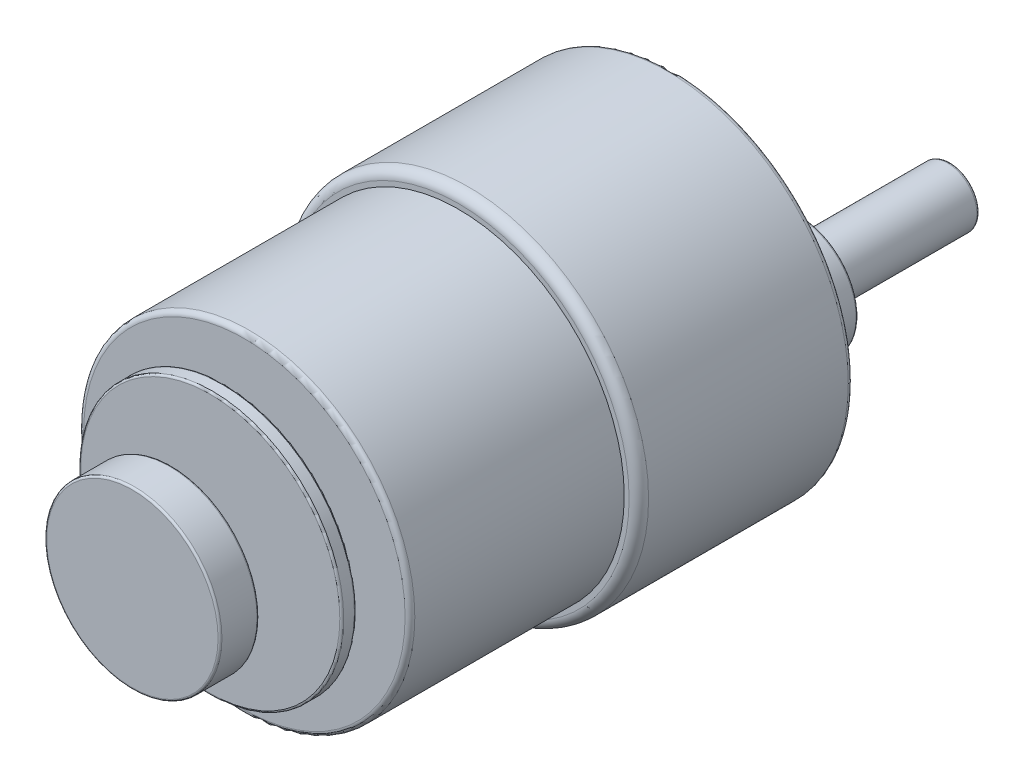
ISO-10303-21;
HEADER;
FILE_DESCRIPTION(('STEP AP214'),'2;1');
FILE_NAME('part.step','',(''),(''),'','','');
FILE_SCHEMA(('AUTOMOTIVE_DESIGN { 1 0 10303 214 1 1 1 1 }'));
ENDSEC;
DATA;
#1=APPLICATION_CONTEXT('core data for automotive mechanical design processes');
#2=APPLICATION_PROTOCOL_DEFINITION('international standard','automotive_design',2000,#1);
#3=PRODUCT_CONTEXT('',#1,'mechanical');
#4=PRODUCT('Part','Part','',(#3));
#5=PRODUCT_RELATED_PRODUCT_CATEGORY('part','',(#4));
#6=PRODUCT_DEFINITION_FORMATION('','',#4);
#7=PRODUCT_DEFINITION_CONTEXT('part definition',#1,'design');
#8=PRODUCT_DEFINITION('design','',#6,#7);
#9=PRODUCT_DEFINITION_SHAPE('','',#8);
#10=(LENGTH_UNIT() NAMED_UNIT(*) SI_UNIT(.MILLI.,.METRE.));
#11=(NAMED_UNIT(*) PLANE_ANGLE_UNIT() SI_UNIT($,.RADIAN.));
#12=(NAMED_UNIT(*) SI_UNIT($,.STERADIAN.) SOLID_ANGLE_UNIT());
#13=UNCERTAINTY_MEASURE_WITH_UNIT(LENGTH_MEASURE(1.E-05),#10,'distance_accuracy_value','');
#14=(GEOMETRIC_REPRESENTATION_CONTEXT(3) GLOBAL_UNCERTAINTY_ASSIGNED_CONTEXT((#13)) GLOBAL_UNIT_ASSIGNED_CONTEXT((#10,
#11,#12)) REPRESENTATION_CONTEXT('',''));
#15=CARTESIAN_POINT('',(0.,0.,0.));
#16=DIRECTION('',(0.,0.,1.));
#17=DIRECTION('',(1.,0.,0.));
#18=AXIS2_PLACEMENT_3D('',#15,#16,#17);
#19=CARTESIAN_POINT('',(0.,0.,22.));
#20=DIRECTION('',(0.,0.,-1.));
#21=DIRECTION('',(-1.,0.,0.));
#22=AXIS2_PLACEMENT_3D('',#19,#20,#21);
#23=CYLINDRICAL_SURFACE('',#22,17.);
#24=CARTESIAN_POINT('',(0.,0.,21.5));
#25=DIRECTION('',(0.,0.,1.));
#26=DIRECTION('',(1.,0.,0.));
#27=AXIS2_PLACEMENT_3D('',#24,#25,#26);
#28=CIRCLE('',#27,17.);
#29=CARTESIAN_POINT('',(17.,0.,21.5));
#30=VERTEX_POINT('',#29);
#31=EDGE_CURVE('E109',#30,#30,#28,.F.);
#32=ORIENTED_EDGE('',*,*,#31,.T.);
#33=EDGE_LOOP('',(#32));
#34=FACE_BOUND('',#33,.T.);
#35=CARTESIAN_POINT('',(0.,0.,0.));
#36=DIRECTION('',(0.,0.,1.));
#37=DIRECTION('',(1.,0.,0.));
#38=AXIS2_PLACEMENT_3D('',#35,#36,#37);
#39=CIRCLE('',#38,17.);
#40=CARTESIAN_POINT('',(17.,0.,0.));
#41=VERTEX_POINT('',#40);
#42=EDGE_CURVE('E118',#41,#41,#39,.T.);
#43=ORIENTED_EDGE('',*,*,#42,.T.);
#44=EDGE_LOOP('',(#43));
#45=FACE_BOUND('',#44,.T.);
#46=ADVANCED_FACE('F37',(#34,#45),#23,.T.);
#47=CARTESIAN_POINT('',(0.,0.,22.));
#48=DIRECTION('',(0.,0.,1.));
#49=DIRECTION('',(1.,0.,0.));
#50=AXIS2_PLACEMENT_3D('',#47,#48,#49);
#51=PLANE('',#50);
#52=CARTESIAN_POINT('',(0.,0.,22.));
#53=DIRECTION('',(0.,0.,1.));
#54=DIRECTION('',(1.,0.,0.));
#55=AXIS2_PLACEMENT_3D('',#52,#53,#54);
#56=CIRCLE('',#55,16.5);
#57=CARTESIAN_POINT('',(16.5,0.,22.));
#58=VERTEX_POINT('',#57);
#59=EDGE_CURVE('E113',#58,#58,#56,.T.);
#60=ORIENTED_EDGE('',*,*,#59,.T.);
#61=EDGE_LOOP('',(#60));
#62=FACE_BOUND('',#61,.T.);
#63=CARTESIAN_POINT('',(0.,0.,22.));
#64=DIRECTION('',(0.,0.,1.));
#65=DIRECTION('',(1.,0.,0.));
#66=AXIS2_PLACEMENT_3D('',#63,#64,#65);
#67=CIRCLE('',#66,3.);
#68=CARTESIAN_POINT('',(3.,0.,22.));
#69=VERTEX_POINT('',#68);
#70=EDGE_CURVE('E117',#69,#69,#67,.T.);
#71=ORIENTED_EDGE('',*,*,#70,.F.);
#72=EDGE_LOOP('',(#71));
#73=FACE_BOUND('',#72,.T.);
#74=ADVANCED_FACE('F171',(#62,#73),#51,.T.);
#75=CARTESIAN_POINT('',(0.,0.,-22.));
#76=DIRECTION('',(0.,0.,1.));
#77=DIRECTION('',(1.,0.,0.));
#78=AXIS2_PLACEMENT_3D('',#75,#76,#77);
#79=CYLINDRICAL_SURFACE('',#78,18.5);
#80=CARTESIAN_POINT('',(0.,0.,-1.));
#81=DIRECTION('',(0.,0.,-1.));
#82=DIRECTION('',(-1.,0.,0.));
#83=AXIS2_PLACEMENT_3D('',#80,#81,#82);
#84=CIRCLE('',#83,18.5);
#85=CARTESIAN_POINT('',(-18.5,0.,-1.));
#86=VERTEX_POINT('',#85);
#87=EDGE_CURVE('E45',#86,#86,#84,.T.);
#88=ORIENTED_EDGE('',*,*,#87,.T.);
#89=EDGE_LOOP('',(#88));
#90=FACE_BOUND('',#89,.T.);
#91=CARTESIAN_POINT('',(0.,0.,-21.5));
#92=DIRECTION('',(0.,0.,-1.));
#93=DIRECTION('',(-1.,0.,0.));
#94=AXIS2_PLACEMENT_3D('',#91,#92,#93);
#95=CIRCLE('',#94,18.5);
#96=CARTESIAN_POINT('',(-18.5,0.,-21.5));
#97=VERTEX_POINT('',#96);
#98=EDGE_CURVE('E101',#97,#97,#95,.F.);
#99=ORIENTED_EDGE('',*,*,#98,.T.);
#100=EDGE_LOOP('',(#99));
#101=FACE_BOUND('',#100,.T.);
#102=ADVANCED_FACE('F177',(#90,#101),#79,.T.);
#103=CARTESIAN_POINT('',(0.,0.,-22.));
#104=DIRECTION('',(0.,0.,-1.));
#105=DIRECTION('',(-1.,0.,0.));
#106=AXIS2_PLACEMENT_3D('',#103,#104,#105);
#107=PLANE('',#106);
#108=CARTESIAN_POINT('',(0.,0.,-22.));
#109=DIRECTION('',(0.,0.,-1.));
#110=DIRECTION('',(-1.,0.,0.));
#111=AXIS2_PLACEMENT_3D('',#108,#109,#110);
#112=CIRCLE('',#111,18.);
#113=CARTESIAN_POINT('',(-18.,0.,-22.));
#114=VERTEX_POINT('',#113);
#115=EDGE_CURVE('E105',#114,#114,#112,.T.);
#116=ORIENTED_EDGE('',*,*,#115,.T.);
#117=EDGE_LOOP('',(#116));
#118=FACE_BOUND('',#117,.T.);
#119=CARTESIAN_POINT('',(7.,0.,-22.));
#120=DIRECTION('',(0.,0.,-1.));
#121=DIRECTION('',(-1.,0.,0.));
#122=AXIS2_PLACEMENT_3D('',#119,#120,#121);
#123=CIRCLE('',#122,6.);
#124=CARTESIAN_POINT('',(0.999999999999999,0.,-22.));
#125=VERTEX_POINT('',#124);
#126=EDGE_CURVE('E122',#125,#125,#123,.T.);
#127=ORIENTED_EDGE('',*,*,#126,.F.);
#128=EDGE_LOOP('',(#127));
#129=FACE_BOUND('',#128,.T.);
#130=ADVANCED_FACE('F243',(#118,#129),#107,.T.);
#131=CARTESIAN_POINT('',(0.,0.,0.));
#132=DIRECTION('',(0.,0.,-1.));
#133=DIRECTION('',(-1.,0.,0.));
#134=AXIS2_PLACEMENT_3D('',#131,#132,#133);
#135=PLANE('',#134);
#136=CARTESIAN_POINT('',(0.,0.,0.));
#137=DIRECTION('',(0.,0.,-1.));
#138=DIRECTION('',(-1.,0.,0.));
#139=AXIS2_PLACEMENT_3D('',#136,#137,#138);
#140=CIRCLE('',#139,17.5);
#141=CARTESIAN_POINT('',(-17.5,0.,0.));
#142=VERTEX_POINT('',#141);
#143=EDGE_CURVE('E10',#142,#142,#140,.F.);
#144=ORIENTED_EDGE('',*,*,#143,.T.);
#145=EDGE_LOOP('',(#144));
#146=FACE_BOUND('',#145,.T.);
#147=ORIENTED_EDGE('',*,*,#42,.F.);
#148=EDGE_LOOP('',(#147));
#149=FACE_BOUND('',#148,.T.);
#150=ADVANCED_FACE('F241',(#146,#149),#135,.F.);
#151=CARTESIAN_POINT('',(7.,0.,-28.));
#152=DIRECTION('',(0.,0.,1.));
#153=DIRECTION('',(1.,0.,0.));
#154=AXIS2_PLACEMENT_3D('',#151,#152,#153);
#155=CYLINDRICAL_SURFACE('',#154,6.);
#156=CARTESIAN_POINT('',(7.,0.,-27.8));
#157=DIRECTION('',(0.,0.,-1.));
#158=DIRECTION('',(-1.,0.,0.));
#159=AXIS2_PLACEMENT_3D('',#156,#157,#158);
#160=CIRCLE('',#159,6.);
#161=CARTESIAN_POINT('',(0.999999999999999,0.,-27.8));
#162=VERTEX_POINT('',#161);
#163=EDGE_CURVE('E61',#162,#162,#160,.F.);
#164=ORIENTED_EDGE('',*,*,#163,.T.);
#165=EDGE_LOOP('',(#164));
#166=FACE_BOUND('',#165,.T.);
#167=ORIENTED_EDGE('',*,*,#126,.T.);
#168=EDGE_LOOP('',(#167));
#169=FACE_BOUND('',#168,.T.);
#170=ADVANCED_FACE('F237',(#166,#169),#155,.T.);
#171=CARTESIAN_POINT('',(7.,0.,-28.));
#172=DIRECTION('',(0.,0.,-1.));
#173=DIRECTION('',(-1.,0.,0.));
#174=AXIS2_PLACEMENT_3D('',#171,#172,#173);
#175=PLANE('',#174);
#176=CARTESIAN_POINT('',(7.,0.,-28.));
#177=DIRECTION('',(0.,0.,-1.));
#178=DIRECTION('',(-1.,0.,0.));
#179=AXIS2_PLACEMENT_3D('',#176,#177,#178);
#180=CIRCLE('',#179,5.8);
#181=CARTESIAN_POINT('',(1.2,0.,-28.));
#182=VERTEX_POINT('',#181);
#183=EDGE_CURVE('E65',#182,#182,#180,.T.);
#184=ORIENTED_EDGE('',*,*,#183,.T.);
#185=EDGE_LOOP('',(#184));
#186=FACE_BOUND('',#185,.T.);
#187=CARTESIAN_POINT('',(7.,0.,-28.));
#188=DIRECTION('',(0.,0.,-1.));
#189=DIRECTION('',(-1.,0.,0.));
#190=AXIS2_PLACEMENT_3D('',#187,#188,#189);
#191=CIRCLE('',#190,3.);
#192=CARTESIAN_POINT('',(4.,0.,-28.));
#193=VERTEX_POINT('',#192);
#194=EDGE_CURVE('E127',#193,#193,#191,.T.);
#195=ORIENTED_EDGE('',*,*,#194,.F.);
#196=EDGE_LOOP('',(#195));
#197=FACE_BOUND('',#196,.T.);
#198=ADVANCED_FACE('F231',(#186,#197),#175,.T.);
#199=CARTESIAN_POINT('',(7.,0.,-43.5));
#200=DIRECTION('',(0.,0.,1.));
#201=DIRECTION('',(1.,0.,0.));
#202=AXIS2_PLACEMENT_3D('',#199,#200,#201);
#203=CYLINDRICAL_SURFACE('',#202,3.);
#204=CARTESIAN_POINT('',(7.,0.,-43.2));
#205=DIRECTION('',(0.,0.,-1.));
#206=DIRECTION('',(-1.,0.,0.));
#207=AXIS2_PLACEMENT_3D('',#204,#205,#206);
#208=CIRCLE('',#207,3.);
#209=CARTESIAN_POINT('',(4.,0.,-43.2));
#210=VERTEX_POINT('',#209);
#211=EDGE_CURVE('E50',#210,#210,#208,.F.);
#212=ORIENTED_EDGE('',*,*,#211,.T.);
#213=EDGE_LOOP('',(#212));
#214=FACE_BOUND('',#213,.T.);
#215=ORIENTED_EDGE('',*,*,#194,.T.);
#216=EDGE_LOOP('',(#215));
#217=FACE_BOUND('',#216,.T.);
#218=ADVANCED_FACE('F223',(#214,#217),#203,.T.);
#219=CARTESIAN_POINT('',(7.,0.,-43.5));
#220=DIRECTION('',(0.,0.,-1.));
#221=DIRECTION('',(-1.,0.,0.));
#222=AXIS2_PLACEMENT_3D('',#219,#220,#221);
#223=PLANE('',#222);
#224=CARTESIAN_POINT('',(7.,0.,-43.5));
#225=DIRECTION('',(0.,0.,-1.));
#226=DIRECTION('',(-1.,0.,0.));
#227=AXIS2_PLACEMENT_3D('',#224,#225,#226);
#228=CIRCLE('',#227,2.7);
#229=CARTESIAN_POINT('',(4.3,0.,-43.5));
#230=VERTEX_POINT('',#229);
#231=EDGE_CURVE('E55',#230,#230,#228,.T.);
#232=ORIENTED_EDGE('',*,*,#231,.T.);
#233=EDGE_LOOP('',(#232));
#234=FACE_BOUND('',#233,.T.);
#235=ADVANCED_FACE('F221',(#234),#223,.T.);
#236=CARTESIAN_POINT('',(0.,0.,24.));
#237=DIRECTION('',(0.,0.,-1.));
#238=DIRECTION('',(-1.,0.,0.));
#239=AXIS2_PLACEMENT_3D('',#236,#237,#238);
#240=CYLINDRICAL_SURFACE('',#239,3.);
#241=CARTESIAN_POINT('',(0.,0.,24.));
#242=DIRECTION('',(0.,0.,1.));
#243=DIRECTION('',(1.,0.,0.));
#244=AXIS2_PLACEMENT_3D('',#241,#242,#243);
#245=CIRCLE('',#244,3.);
#246=CARTESIAN_POINT('',(3.,0.,24.));
#247=VERTEX_POINT('',#246);
#248=EDGE_CURVE('E123',#247,#247,#245,.T.);
#249=ORIENTED_EDGE('',*,*,#248,.F.);
#250=EDGE_LOOP('',(#249));
#251=FACE_BOUND('',#250,.T.);
#252=ORIENTED_EDGE('',*,*,#70,.T.);
#253=EDGE_LOOP('',(#252));
#254=FACE_BOUND('',#253,.T.);
#255=ADVANCED_FACE('F167',(#251,#254),#240,.T.);
#256=CARTESIAN_POINT('',(0.,0.,25.5));
#257=DIRECTION('',(0.,0.,-1.));
#258=DIRECTION('',(-1.,0.,0.));
#259=AXIS2_PLACEMENT_3D('',#256,#257,#258);
#260=CYLINDRICAL_SURFACE('',#259,13.5);
#261=CARTESIAN_POINT('',(0.,0.,24.2));
#262=DIRECTION('',(0.,0.,1.));
#263=DIRECTION('',(1.,0.,0.));
#264=AXIS2_PLACEMENT_3D('',#261,#262,#263);
#265=CIRCLE('',#264,13.5);
#266=CARTESIAN_POINT('',(13.5,0.,24.2));
#267=VERTEX_POINT('',#266);
#268=EDGE_CURVE('E89',#267,#267,#265,.T.);
#269=ORIENTED_EDGE('',*,*,#268,.T.);
#270=EDGE_LOOP('',(#269));
#271=FACE_BOUND('',#270,.T.);
#272=CARTESIAN_POINT('',(0.,0.,25.3));
#273=DIRECTION('',(0.,0.,1.));
#274=DIRECTION('',(1.,0.,0.));
#275=AXIS2_PLACEMENT_3D('',#272,#273,#274);
#276=CIRCLE('',#275,13.5);
#277=CARTESIAN_POINT('',(13.5,0.,25.3));
#278=VERTEX_POINT('',#277);
#279=EDGE_CURVE('E93',#278,#278,#276,.F.);
#280=ORIENTED_EDGE('',*,*,#279,.T.);
#281=EDGE_LOOP('',(#280));
#282=FACE_BOUND('',#281,.T.);
#283=ADVANCED_FACE('F158',(#271,#282),#260,.T.);
#284=CARTESIAN_POINT('',(0.,0.,25.5));
#285=DIRECTION('',(0.,0.,1.));
#286=DIRECTION('',(1.,0.,0.));
#287=AXIS2_PLACEMENT_3D('',#284,#285,#286);
#288=PLANE('',#287);
#289=CARTESIAN_POINT('',(0.,0.,25.5));
#290=DIRECTION('',(0.,0.,1.));
#291=DIRECTION('',(1.,0.,0.));
#292=AXIS2_PLACEMENT_3D('',#289,#290,#291);
#293=CIRCLE('',#292,13.3);
#294=CARTESIAN_POINT('',(13.3,0.,25.5));
#295=VERTEX_POINT('',#294);
#296=EDGE_CURVE('E97',#295,#295,#293,.T.);
#297=ORIENTED_EDGE('',*,*,#296,.T.);
#298=EDGE_LOOP('',(#297));
#299=FACE_BOUND('',#298,.T.);
#300=CARTESIAN_POINT('',(0.,0.,25.5));
#301=DIRECTION('',(0.,0.,1.));
#302=DIRECTION('',(1.,0.,0.));
#303=AXIS2_PLACEMENT_3D('',#300,#301,#302);
#304=CIRCLE('',#303,1.);
#305=CARTESIAN_POINT('',(1.,0.,25.5));
#306=VERTEX_POINT('',#305);
#307=EDGE_CURVE('E138',#306,#306,#304,.T.);
#308=ORIENTED_EDGE('',*,*,#307,.F.);
#309=EDGE_LOOP('',(#308));
#310=FACE_BOUND('',#309,.T.);
#311=ADVANCED_FACE('F156',(#299,#310),#288,.T.);
#312=CARTESIAN_POINT('',(0.,0.,24.));
#313=DIRECTION('',(0.,0.,1.));
#314=DIRECTION('',(1.,0.,0.));
#315=AXIS2_PLACEMENT_3D('',#312,#313,#314);
#316=PLANE('',#315);
#317=CARTESIAN_POINT('',(0.,0.,24.));
#318=DIRECTION('',(0.,0.,1.));
#319=DIRECTION('',(1.,0.,0.));
#320=AXIS2_PLACEMENT_3D('',#317,#318,#319);
#321=CIRCLE('',#320,13.3);
#322=CARTESIAN_POINT('',(13.3,0.,24.));
#323=VERTEX_POINT('',#322);
#324=EDGE_CURVE('E85',#323,#323,#321,.F.);
#325=ORIENTED_EDGE('',*,*,#324,.T.);
#326=EDGE_LOOP('',(#325));
#327=FACE_BOUND('',#326,.T.);
#328=ORIENTED_EDGE('',*,*,#248,.T.);
#329=EDGE_LOOP('',(#328));
#330=FACE_BOUND('',#329,.T.);
#331=ADVANCED_FACE('F152',(#327,#330),#316,.F.);
#332=CARTESIAN_POINT('',(0.,0.,29.5));
#333=DIRECTION('',(0.,0.,-1.));
#334=DIRECTION('',(-1.,0.,0.));
#335=AXIS2_PLACEMENT_3D('',#332,#333,#334);
#336=CYLINDRICAL_SURFACE('',#335,1.);
#337=CARTESIAN_POINT('',(0.,0.,29.5));
#338=DIRECTION('',(0.,0.,1.));
#339=DIRECTION('',(1.,0.,0.));
#340=AXIS2_PLACEMENT_3D('',#337,#338,#339);
#341=CIRCLE('',#340,1.);
#342=CARTESIAN_POINT('',(1.,0.,29.5));
#343=VERTEX_POINT('',#342);
#344=EDGE_CURVE('E137',#343,#343,#341,.T.);
#345=ORIENTED_EDGE('',*,*,#344,.F.);
#346=EDGE_LOOP('',(#345));
#347=FACE_BOUND('',#346,.T.);
#348=ORIENTED_EDGE('',*,*,#307,.T.);
#349=EDGE_LOOP('',(#348));
#350=FACE_BOUND('',#349,.T.);
#351=ADVANCED_FACE('F148',(#347,#350),#336,.T.);
#352=CARTESIAN_POINT('',(0.,0.,33.5));
#353=DIRECTION('',(0.,0.,-1.));
#354=DIRECTION('',(-1.,0.,0.));
#355=AXIS2_PLACEMENT_3D('',#352,#353,#354);
#356=CYLINDRICAL_SURFACE('',#355,9.);
#357=CARTESIAN_POINT('',(0.,0.,29.7));
#358=DIRECTION('',(0.,0.,1.));
#359=DIRECTION('',(1.,0.,0.));
#360=AXIS2_PLACEMENT_3D('',#357,#358,#359);
#361=CIRCLE('',#360,9.);
#362=CARTESIAN_POINT('',(9.,0.,29.7));
#363=VERTEX_POINT('',#362);
#364=EDGE_CURVE('E73',#363,#363,#361,.T.);
#365=ORIENTED_EDGE('',*,*,#364,.T.);
#366=EDGE_LOOP('',(#365));
#367=FACE_BOUND('',#366,.T.);
#368=CARTESIAN_POINT('',(0.,0.,33.3));
#369=DIRECTION('',(0.,0.,1.));
#370=DIRECTION('',(1.,0.,0.));
#371=AXIS2_PLACEMENT_3D('',#368,#369,#370);
#372=CIRCLE('',#371,9.);
#373=CARTESIAN_POINT('',(9.,0.,33.3));
#374=VERTEX_POINT('',#373);
#375=EDGE_CURVE('E77',#374,#374,#372,.F.);
#376=ORIENTED_EDGE('',*,*,#375,.T.);
#377=EDGE_LOOP('',(#376));
#378=FACE_BOUND('',#377,.T.);
#379=ADVANCED_FACE('F151',(#367,#378),#356,.T.);
#380=CARTESIAN_POINT('',(0.,0.,33.5));
#381=DIRECTION('',(0.,0.,1.));
#382=DIRECTION('',(1.,0.,0.));
#383=AXIS2_PLACEMENT_3D('',#380,#381,#382);
#384=PLANE('',#383);
#385=CARTESIAN_POINT('',(0.,0.,33.5));
#386=DIRECTION('',(0.,0.,1.));
#387=DIRECTION('',(1.,0.,0.));
#388=AXIS2_PLACEMENT_3D('',#385,#386,#387);
#389=CIRCLE('',#388,8.8);
#390=CARTESIAN_POINT('',(8.8,0.,33.5));
#391=VERTEX_POINT('',#390);
#392=EDGE_CURVE('E81',#391,#391,#389,.T.);
#393=ORIENTED_EDGE('',*,*,#392,.T.);
#394=EDGE_LOOP('',(#393));
#395=FACE_BOUND('',#394,.T.);
#396=ADVANCED_FACE('F344',(#395),#384,.T.);
#397=CARTESIAN_POINT('',(0.,0.,29.5));
#398=DIRECTION('',(0.,0.,1.));
#399=DIRECTION('',(1.,0.,0.));
#400=AXIS2_PLACEMENT_3D('',#397,#398,#399);
#401=PLANE('',#400);
#402=CARTESIAN_POINT('',(0.,0.,29.5));
#403=DIRECTION('',(0.,0.,1.));
#404=DIRECTION('',(1.,0.,0.));
#405=AXIS2_PLACEMENT_3D('',#402,#403,#404);
#406=CIRCLE('',#405,8.8);
#407=CARTESIAN_POINT('',(8.8,0.,29.5));
#408=VERTEX_POINT('',#407);
#409=EDGE_CURVE('E69',#408,#408,#406,.F.);
#410=ORIENTED_EDGE('',*,*,#409,.T.);
#411=EDGE_LOOP('',(#410));
#412=FACE_BOUND('',#411,.T.);
#413=ORIENTED_EDGE('',*,*,#344,.T.);
#414=EDGE_LOOP('',(#413));
#415=FACE_BOUND('',#414,.T.);
#416=ADVANCED_FACE('F146',(#412,#415),#401,.F.);
#417=CARTESIAN_POINT('',(0.,0.,21.5));
#418=DIRECTION('',(0.,0.,1.));
#419=DIRECTION('',(1.,0.,0.));
#420=AXIS2_PLACEMENT_3D('',#417,#418,#419);
#421=TOROIDAL_SURFACE('',#420,16.5,0.5);
#422=ORIENTED_EDGE('',*,*,#31,.F.);
#423=EDGE_LOOP('',(#422));
#424=FACE_BOUND('',#423,.T.);
#425=ORIENTED_EDGE('',*,*,#59,.F.);
#426=EDGE_LOOP('',(#425));
#427=FACE_BOUND('',#426,.T.);
#428=ADVANCED_FACE('F183',(#424,#427),#421,.T.);
#429=CARTESIAN_POINT('',(0.,0.,-21.5));
#430=DIRECTION('',(0.,0.,-1.));
#431=DIRECTION('',(-1.,0.,0.));
#432=AXIS2_PLACEMENT_3D('',#429,#430,#431);
#433=TOROIDAL_SURFACE('',#432,18.,0.5);
#434=ORIENTED_EDGE('',*,*,#98,.F.);
#435=EDGE_LOOP('',(#434));
#436=FACE_BOUND('',#435,.T.);
#437=ORIENTED_EDGE('',*,*,#115,.F.);
#438=EDGE_LOOP('',(#437));
#439=FACE_BOUND('',#438,.T.);
#440=ADVANCED_FACE('F186',(#436,#439),#433,.T.);
#441=CARTESIAN_POINT('',(0.,0.,25.3));
#442=DIRECTION('',(0.,0.,1.));
#443=DIRECTION('',(1.,0.,0.));
#444=AXIS2_PLACEMENT_3D('',#441,#442,#443);
#445=TOROIDAL_SURFACE('',#444,13.3,0.2);
#446=ORIENTED_EDGE('',*,*,#279,.F.);
#447=EDGE_LOOP('',(#446));
#448=FACE_BOUND('',#447,.T.);
#449=ORIENTED_EDGE('',*,*,#296,.F.);
#450=EDGE_LOOP('',(#449));
#451=FACE_BOUND('',#450,.T.);
#452=ADVANCED_FACE('F190',(#448,#451),#445,.T.);
#453=CARTESIAN_POINT('',(0.,0.,24.2));
#454=DIRECTION('',(0.,0.,1.));
#455=DIRECTION('',(1.,0.,0.));
#456=AXIS2_PLACEMENT_3D('',#453,#454,#455);
#457=TOROIDAL_SURFACE('',#456,13.3,0.2);
#458=ORIENTED_EDGE('',*,*,#324,.F.);
#459=EDGE_LOOP('',(#458));
#460=FACE_BOUND('',#459,.T.);
#461=ORIENTED_EDGE('',*,*,#268,.F.);
#462=EDGE_LOOP('',(#461));
#463=FACE_BOUND('',#462,.T.);
#464=ADVANCED_FACE('F194',(#460,#463),#457,.T.);
#465=CARTESIAN_POINT('',(0.,0.,33.3));
#466=DIRECTION('',(0.,0.,1.));
#467=DIRECTION('',(1.,0.,0.));
#468=AXIS2_PLACEMENT_3D('',#465,#466,#467);
#469=TOROIDAL_SURFACE('',#468,8.8,0.2);
#470=ORIENTED_EDGE('',*,*,#375,.F.);
#471=EDGE_LOOP('',(#470));
#472=FACE_BOUND('',#471,.T.);
#473=ORIENTED_EDGE('',*,*,#392,.F.);
#474=EDGE_LOOP('',(#473));
#475=FACE_BOUND('',#474,.T.);
#476=ADVANCED_FACE('F198',(#472,#475),#469,.T.);
#477=CARTESIAN_POINT('',(0.,0.,29.7));
#478=DIRECTION('',(0.,0.,1.));
#479=DIRECTION('',(1.,0.,0.));
#480=AXIS2_PLACEMENT_3D('',#477,#478,#479);
#481=TOROIDAL_SURFACE('',#480,8.8,0.2);
#482=ORIENTED_EDGE('',*,*,#409,.F.);
#483=EDGE_LOOP('',(#482));
#484=FACE_BOUND('',#483,.T.);
#485=ORIENTED_EDGE('',*,*,#364,.F.);
#486=EDGE_LOOP('',(#485));
#487=FACE_BOUND('',#486,.T.);
#488=ADVANCED_FACE('F202',(#484,#487),#481,.T.);
#489=CARTESIAN_POINT('',(7.,0.,-27.8));
#490=DIRECTION('',(0.,0.,-1.));
#491=DIRECTION('',(-1.,0.,0.));
#492=AXIS2_PLACEMENT_3D('',#489,#490,#491);
#493=TOROIDAL_SURFACE('',#492,5.8,0.2);
#494=ORIENTED_EDGE('',*,*,#163,.F.);
#495=EDGE_LOOP('',(#494));
#496=FACE_BOUND('',#495,.T.);
#497=ORIENTED_EDGE('',*,*,#183,.F.);
#498=EDGE_LOOP('',(#497));
#499=FACE_BOUND('',#498,.T.);
#500=ADVANCED_FACE('F206',(#496,#499),#493,.T.);
#501=CARTESIAN_POINT('',(7.,0.,-43.2));
#502=DIRECTION('',(0.,0.,-1.));
#503=DIRECTION('',(-1.,0.,0.));
#504=AXIS2_PLACEMENT_3D('',#501,#502,#503);
#505=TOROIDAL_SURFACE('',#504,2.7,0.3);
#506=ORIENTED_EDGE('',*,*,#211,.F.);
#507=EDGE_LOOP('',(#506));
#508=FACE_BOUND('',#507,.T.);
#509=ORIENTED_EDGE('',*,*,#231,.F.);
#510=EDGE_LOOP('',(#509));
#511=FACE_BOUND('',#510,.T.);
#512=ADVANCED_FACE('F209',(#508,#511),#505,.T.);
#513=CARTESIAN_POINT('',(0.,0.,-1.));
#514=DIRECTION('',(0.,0.,-1.));
#515=DIRECTION('',(-1.,0.,0.));
#516=AXIS2_PLACEMENT_3D('',#513,#514,#515);
#517=TOROIDAL_SURFACE('',#516,17.5,1.);
#518=ORIENTED_EDGE('',*,*,#143,.F.);
#519=EDGE_LOOP('',(#518));
#520=FACE_BOUND('',#519,.T.);
#521=ORIENTED_EDGE('',*,*,#87,.F.);
#522=EDGE_LOOP('',(#521));
#523=FACE_BOUND('',#522,.T.);
#524=ADVANCED_FACE('F39',(#520,#523),#517,.T.);
#525=CLOSED_SHELL('',(#46,#74,#102,#130,#150,#170,#198,#218,#235,#255,#283,#311,#331,#351,#379,
#396,#416,#428,#440,#452,#464,#476,#488,#500,#512,#524));
#526=MANIFOLD_SOLID_BREP('B2',#525);
#527=ADVANCED_BREP_SHAPE_REPRESENTATION('',(#18,#526),#14);
#528=SHAPE_DEFINITION_REPRESENTATION(#9,#527);
ENDSEC;
END-ISO-10303-21;
